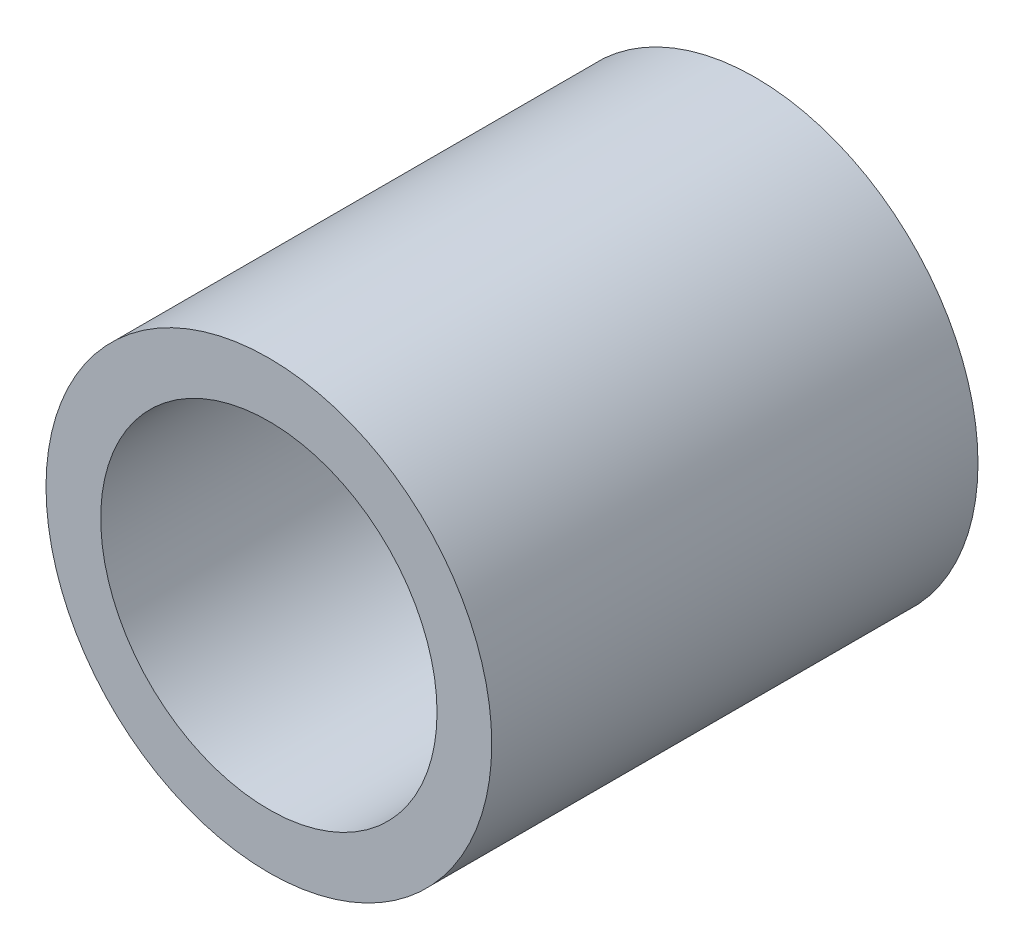
ISO-10303-21;
HEADER;
FILE_DESCRIPTION(('STEP AP214'),'2;1');
FILE_NAME('part.step','',(''),(''),'','','');
FILE_SCHEMA(('AUTOMOTIVE_DESIGN { 1 0 10303 214 1 1 1 1 }'));
ENDSEC;
DATA;
#1=APPLICATION_CONTEXT('core data for automotive mechanical design processes');
#2=APPLICATION_PROTOCOL_DEFINITION('international standard','automotive_design',2000,#1);
#3=PRODUCT_CONTEXT('',#1,'mechanical');
#4=PRODUCT('Part','Part','',(#3));
#5=PRODUCT_RELATED_PRODUCT_CATEGORY('part','',(#4));
#6=PRODUCT_DEFINITION_FORMATION('','',#4);
#7=PRODUCT_DEFINITION_CONTEXT('part definition',#1,'design');
#8=PRODUCT_DEFINITION('design','',#6,#7);
#9=PRODUCT_DEFINITION_SHAPE('','',#8);
#10=(LENGTH_UNIT() NAMED_UNIT(*) SI_UNIT(.MILLI.,.METRE.));
#11=(NAMED_UNIT(*) PLANE_ANGLE_UNIT() SI_UNIT($,.RADIAN.));
#12=(NAMED_UNIT(*) SI_UNIT($,.STERADIAN.) SOLID_ANGLE_UNIT());
#13=UNCERTAINTY_MEASURE_WITH_UNIT(LENGTH_MEASURE(1.E-05),#10,'distance_accuracy_value','');
#14=(GEOMETRIC_REPRESENTATION_CONTEXT(3) GLOBAL_UNCERTAINTY_ASSIGNED_CONTEXT((#13)) GLOBAL_UNIT_ASSIGNED_CONTEXT((#10,
#11,#12)) REPRESENTATION_CONTEXT('',''));
#15=CARTESIAN_POINT('',(0.,0.,0.));
#16=DIRECTION('',(0.,0.,1.));
#17=DIRECTION('',(1.,0.,0.));
#18=AXIS2_PLACEMENT_3D('',#15,#16,#17);
#19=CARTESIAN_POINT('',(0.,0.,12.));
#20=DIRECTION('',(0.,0.,1.));
#21=DIRECTION('',(1.,0.,0.));
#22=AXIS2_PLACEMENT_3D('',#19,#20,#21);
#23=PLANE('',#22);
#24=CARTESIAN_POINT('',(0.,0.,12.));
#25=DIRECTION('',(0.,0.,1.));
#26=DIRECTION('',(1.,0.,0.));
#27=AXIS2_PLACEMENT_3D('',#24,#25,#26);
#28=CIRCLE('',#27,5.5);
#29=CARTESIAN_POINT('',(5.5,0.,12.));
#30=VERTEX_POINT('',#29);
#31=EDGE_CURVE('E10',#30,#30,#28,.T.);
#32=ORIENTED_EDGE('',*,*,#31,.T.);
#33=EDGE_LOOP('',(#32));
#34=FACE_BOUND('',#33,.T.);
#35=CARTESIAN_POINT('',(0.,0.,12.));
#36=DIRECTION('',(0.,0.,1.));
#37=DIRECTION('',(1.,0.,0.));
#38=AXIS2_PLACEMENT_3D('',#35,#36,#37);
#39=CIRCLE('',#38,4.15);
#40=CARTESIAN_POINT('',(4.15,0.,12.));
#41=VERTEX_POINT('',#40);
#42=EDGE_CURVE('E42',#41,#41,#39,.T.);
#43=ORIENTED_EDGE('',*,*,#42,.F.);
#44=EDGE_LOOP('',(#43));
#45=FACE_BOUND('',#44,.T.);
#46=ADVANCED_FACE('F31',(#34,#45),#23,.T.);
#47=CARTESIAN_POINT('',(0.,0.,0.));
#48=DIRECTION('',(0.,0.,1.));
#49=DIRECTION('',(1.,0.,0.));
#50=AXIS2_PLACEMENT_3D('',#47,#48,#49);
#51=PLANE('',#50);
#52=CARTESIAN_POINT('',(0.,0.,0.));
#53=DIRECTION('',(0.,0.,1.));
#54=DIRECTION('',(1.,0.,0.));
#55=AXIS2_PLACEMENT_3D('',#52,#53,#54);
#56=CIRCLE('',#55,5.5);
#57=CARTESIAN_POINT('',(5.5,0.,0.));
#58=VERTEX_POINT('',#57);
#59=EDGE_CURVE('E35',#58,#58,#56,.T.);
#60=ORIENTED_EDGE('',*,*,#59,.F.);
#61=EDGE_LOOP('',(#60));
#62=FACE_BOUND('',#61,.T.);
#63=CARTESIAN_POINT('',(0.,0.,0.));
#64=DIRECTION('',(0.,0.,1.));
#65=DIRECTION('',(1.,0.,0.));
#66=AXIS2_PLACEMENT_3D('',#63,#64,#65);
#67=CIRCLE('',#66,4.15);
#68=CARTESIAN_POINT('',(4.15,0.,0.));
#69=VERTEX_POINT('',#68);
#70=EDGE_CURVE('E44',#69,#69,#67,.T.);
#71=ORIENTED_EDGE('',*,*,#70,.T.);
#72=EDGE_LOOP('',(#71));
#73=FACE_BOUND('',#72,.T.);
#74=ADVANCED_FACE('F54',(#62,#73),#51,.F.);
#75=CARTESIAN_POINT('',(0.,0.,12.));
#76=DIRECTION('',(0.,0.,-1.));
#77=DIRECTION('',(-1.,0.,0.));
#78=AXIS2_PLACEMENT_3D('',#75,#76,#77);
#79=CYLINDRICAL_SURFACE('',#78,5.5);
#80=ORIENTED_EDGE('',*,*,#31,.F.);
#81=EDGE_LOOP('',(#80));
#82=FACE_BOUND('',#81,.T.);
#83=ORIENTED_EDGE('',*,*,#59,.T.);
#84=EDGE_LOOP('',(#83));
#85=FACE_BOUND('',#84,.T.);
#86=ADVANCED_FACE('F33',(#82,#85),#79,.T.);
#87=CARTESIAN_POINT('',(0.,0.,12.));
#88=DIRECTION('',(0.,0.,-1.));
#89=DIRECTION('',(-1.,0.,0.));
#90=AXIS2_PLACEMENT_3D('',#87,#88,#89);
#91=CYLINDRICAL_SURFACE('',#90,4.15);
#92=ORIENTED_EDGE('',*,*,#42,.T.);
#93=EDGE_LOOP('',(#92));
#94=FACE_BOUND('',#93,.T.);
#95=ORIENTED_EDGE('',*,*,#70,.F.);
#96=EDGE_LOOP('',(#95));
#97=FACE_BOUND('',#96,.T.);
#98=ADVANCED_FACE('F50',(#94,#97),#91,.F.);
#99=CLOSED_SHELL('',(#46,#74,#86,#98));
#100=MANIFOLD_SOLID_BREP('B2',#99);
#101=ADVANCED_BREP_SHAPE_REPRESENTATION('',(#18,#100),#14);
#102=SHAPE_DEFINITION_REPRESENTATION(#9,#101);
ENDSEC;
END-ISO-10303-21;
